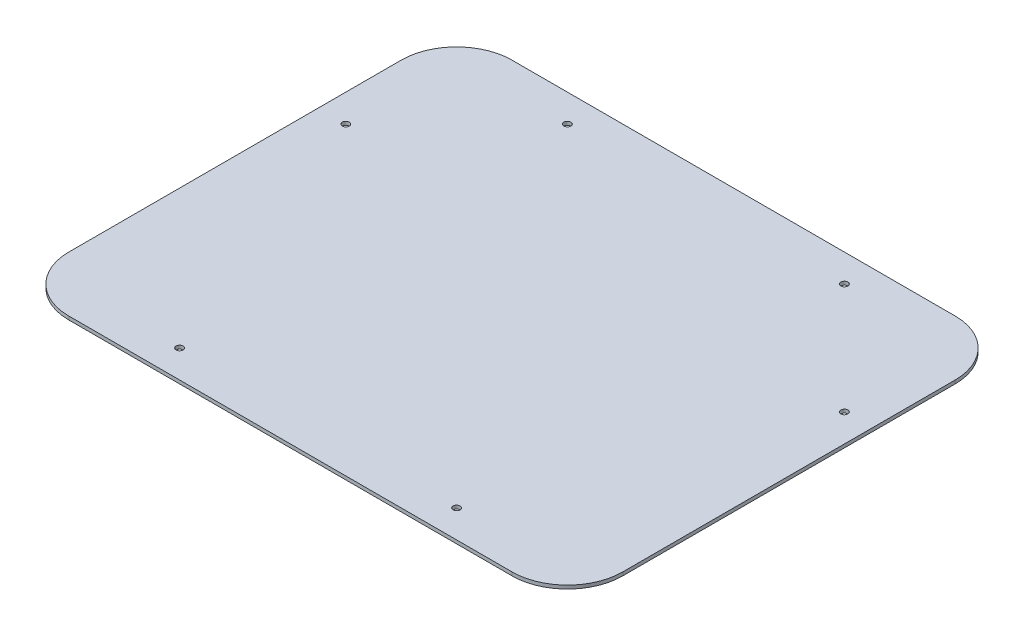
ISO-10303-21;
HEADER;
FILE_DESCRIPTION(('STEP AP214'),'2;1');
FILE_NAME('part.step','',(''),(''),'','','');
FILE_SCHEMA(('AUTOMOTIVE_DESIGN { 1 0 10303 214 1 1 1 1 }'));
ENDSEC;
DATA;
#1=APPLICATION_CONTEXT('core data for automotive mechanical design processes');
#2=APPLICATION_PROTOCOL_DEFINITION('international standard','automotive_design',2000,#1);
#3=PRODUCT_CONTEXT('',#1,'mechanical');
#4=PRODUCT('Part','Part','',(#3));
#5=PRODUCT_RELATED_PRODUCT_CATEGORY('part','',(#4));
#6=PRODUCT_DEFINITION_FORMATION('','',#4);
#7=PRODUCT_DEFINITION_CONTEXT('part definition',#1,'design');
#8=PRODUCT_DEFINITION('design','',#6,#7);
#9=PRODUCT_DEFINITION_SHAPE('','',#8);
#10=(LENGTH_UNIT() NAMED_UNIT(*) SI_UNIT(.MILLI.,.METRE.));
#11=(NAMED_UNIT(*) PLANE_ANGLE_UNIT() SI_UNIT($,.RADIAN.));
#12=(NAMED_UNIT(*) SI_UNIT($,.STERADIAN.) SOLID_ANGLE_UNIT());
#13=UNCERTAINTY_MEASURE_WITH_UNIT(LENGTH_MEASURE(1.E-05),#10,'distance_accuracy_value','');
#14=(GEOMETRIC_REPRESENTATION_CONTEXT(3) GLOBAL_UNCERTAINTY_ASSIGNED_CONTEXT((#13)) GLOBAL_UNIT_ASSIGNED_CONTEXT((#10,
#11,#12)) REPRESENTATION_CONTEXT('',''));
#15=CARTESIAN_POINT('',(0.,0.,0.));
#16=DIRECTION('',(0.,0.,1.));
#17=DIRECTION('',(1.,0.,0.));
#18=AXIS2_PLACEMENT_3D('',#15,#16,#17);
#19=CARTESIAN_POINT('',(-254.,3.175,-203.2));
#20=DIRECTION('',(1.,0.,0.));
#21=DIRECTION('',(0.,0.,-1.));
#22=AXIS2_PLACEMENT_3D('',#19,#20,#21);
#23=PLANE('',#22);
#24=DIRECTION('',(0.,0.,1.));
#25=VECTOR('',#24,1.);
#26=CARTESIAN_POINT('',(-254.,3.175,-203.2));
#27=LINE('',#26,#25);
#28=CARTESIAN_POINT('',(-254.,3.175,-152.4));
#29=VERTEX_POINT('',#28);
#30=CARTESIAN_POINT('',(-254.,3.175,152.4));
#31=VERTEX_POINT('',#30);
#32=EDGE_CURVE('E118',#29,#31,#27,.T.);
#33=ORIENTED_EDGE('',*,*,#32,.F.);
#34=DIRECTION('',(0.,-1.,0.));
#35=VECTOR('',#34,1.);
#36=CARTESIAN_POINT('',(-254.,3.175,-152.4));
#37=LINE('',#36,#35);
#38=CARTESIAN_POINT('',(-254.,0.,-152.4));
#39=VERTEX_POINT('',#38);
#40=EDGE_CURVE('E103',#29,#39,#37,.T.);
#41=ORIENTED_EDGE('',*,*,#40,.T.);
#42=DIRECTION('',(0.,0.,1.));
#43=VECTOR('',#42,1.);
#44=CARTESIAN_POINT('',(-254.,0.,-203.2));
#45=LINE('',#44,#43);
#46=CARTESIAN_POINT('',(-254.,0.,152.4));
#47=VERTEX_POINT('',#46);
#48=EDGE_CURVE('E115',#39,#47,#45,.T.);
#49=ORIENTED_EDGE('',*,*,#48,.T.);
#50=DIRECTION('',(0.,-1.,0.));
#51=VECTOR('',#50,1.);
#52=CARTESIAN_POINT('',(-254.,3.175,152.4));
#53=LINE('',#52,#51);
#54=EDGE_CURVE('E120',#47,#31,#53,.F.);
#55=ORIENTED_EDGE('',*,*,#54,.T.);
#56=EDGE_LOOP('',(#33,#41,#49,#55));
#57=FACE_BOUND('',#56,.T.);
#58=ADVANCED_FACE('F33',(#57),#23,.F.);
#59=CARTESIAN_POINT('',(-254.,3.175,203.2));
#60=DIRECTION('',(0.,0.,-1.));
#61=DIRECTION('',(-1.,0.,0.));
#62=AXIS2_PLACEMENT_3D('',#59,#60,#61);
#63=PLANE('',#62);
#64=DIRECTION('',(1.,0.,0.));
#65=VECTOR('',#64,1.);
#66=CARTESIAN_POINT('',(-254.,0.,203.2));
#67=LINE('',#66,#65);
#68=CARTESIAN_POINT('',(-203.2,0.,203.2));
#69=VERTEX_POINT('',#68);
#70=CARTESIAN_POINT('',(203.2,0.,203.2));
#71=VERTEX_POINT('',#70);
#72=EDGE_CURVE('E124',#69,#71,#67,.T.);
#73=ORIENTED_EDGE('',*,*,#72,.T.);
#74=DIRECTION('',(0.,-1.,0.));
#75=VECTOR('',#74,1.);
#76=CARTESIAN_POINT('',(203.2,3.175,203.2));
#77=LINE('',#76,#75);
#78=CARTESIAN_POINT('',(203.2,3.175,203.2));
#79=VERTEX_POINT('',#78);
#80=EDGE_CURVE('E11',#71,#79,#77,.F.);
#81=ORIENTED_EDGE('',*,*,#80,.T.);
#82=DIRECTION('',(1.,0.,0.));
#83=VECTOR('',#82,1.);
#84=CARTESIAN_POINT('',(-254.,3.175,203.2));
#85=LINE('',#84,#83);
#86=CARTESIAN_POINT('',(-203.2,3.175,203.2));
#87=VERTEX_POINT('',#86);
#88=EDGE_CURVE('E164',#87,#79,#85,.T.);
#89=ORIENTED_EDGE('',*,*,#88,.F.);
#90=DIRECTION('',(0.,-1.,0.));
#91=VECTOR('',#90,1.);
#92=CARTESIAN_POINT('',(-203.2,3.175,203.2));
#93=LINE('',#92,#91);
#94=EDGE_CURVE('E41',#87,#69,#93,.T.);
#95=ORIENTED_EDGE('',*,*,#94,.T.);
#96=EDGE_LOOP('',(#73,#81,#89,#95));
#97=FACE_BOUND('',#96,.T.);
#98=ADVANCED_FACE('F162',(#97),#63,.F.);
#99=CARTESIAN_POINT('',(254.,3.175,-203.2));
#100=DIRECTION('',(-1.,0.,0.));
#101=DIRECTION('',(0.,0.,1.));
#102=AXIS2_PLACEMENT_3D('',#99,#100,#101);
#103=PLANE('',#102);
#104=DIRECTION('',(0.,0.,-1.));
#105=VECTOR('',#104,1.);
#106=CARTESIAN_POINT('',(254.,0.,-203.2));
#107=LINE('',#106,#105);
#108=CARTESIAN_POINT('',(254.,0.,152.4));
#109=VERTEX_POINT('',#108);
#110=CARTESIAN_POINT('',(254.,0.,-152.4));
#111=VERTEX_POINT('',#110);
#112=EDGE_CURVE('E128',#109,#111,#107,.T.);
#113=ORIENTED_EDGE('',*,*,#112,.T.);
#114=DIRECTION('',(0.,-1.,0.));
#115=VECTOR('',#114,1.);
#116=CARTESIAN_POINT('',(254.,3.175,-152.4));
#117=LINE('',#116,#115);
#118=CARTESIAN_POINT('',(254.,3.175,-152.4));
#119=VERTEX_POINT('',#118);
#120=EDGE_CURVE('E48',#111,#119,#117,.F.);
#121=ORIENTED_EDGE('',*,*,#120,.T.);
#122=DIRECTION('',(0.,0.,-1.));
#123=VECTOR('',#122,1.);
#124=CARTESIAN_POINT('',(254.,3.175,-203.2));
#125=LINE('',#124,#123);
#126=CARTESIAN_POINT('',(254.,3.175,152.4));
#127=VERTEX_POINT('',#126);
#128=EDGE_CURVE('E172',#127,#119,#125,.T.);
#129=ORIENTED_EDGE('',*,*,#128,.F.);
#130=DIRECTION('',(0.,-1.,0.));
#131=VECTOR('',#130,1.);
#132=CARTESIAN_POINT('',(254.,3.175,152.4));
#133=LINE('',#132,#131);
#134=EDGE_CURVE('E155',#127,#109,#133,.T.);
#135=ORIENTED_EDGE('',*,*,#134,.T.);
#136=EDGE_LOOP('',(#113,#121,#129,#135));
#137=FACE_BOUND('',#136,.T.);
#138=ADVANCED_FACE('F171',(#137),#103,.F.);
#139=CARTESIAN_POINT('',(-254.,3.175,-203.2));
#140=DIRECTION('',(0.,0.,1.));
#141=DIRECTION('',(1.,0.,0.));
#142=AXIS2_PLACEMENT_3D('',#139,#140,#141);
#143=PLANE('',#142);
#144=DIRECTION('',(-1.,0.,0.));
#145=VECTOR('',#144,1.);
#146=CARTESIAN_POINT('',(-254.,0.,-203.2));
#147=LINE('',#146,#145);
#148=CARTESIAN_POINT('',(203.2,0.,-203.2));
#149=VERTEX_POINT('',#148);
#150=CARTESIAN_POINT('',(-203.2,0.,-203.2));
#151=VERTEX_POINT('',#150);
#152=EDGE_CURVE('E138',#149,#151,#147,.T.);
#153=ORIENTED_EDGE('',*,*,#152,.T.);
#154=DIRECTION('',(0.,-1.,0.));
#155=VECTOR('',#154,1.);
#156=CARTESIAN_POINT('',(-203.2,3.175,-203.2));
#157=LINE('',#156,#155);
#158=CARTESIAN_POINT('',(-203.2,3.175,-203.2));
#159=VERTEX_POINT('',#158);
#160=EDGE_CURVE('E104',#151,#159,#157,.F.);
#161=ORIENTED_EDGE('',*,*,#160,.T.);
#162=DIRECTION('',(-1.,0.,0.));
#163=VECTOR('',#162,1.);
#164=CARTESIAN_POINT('',(-254.,3.175,-203.2));
#165=LINE('',#164,#163);
#166=CARTESIAN_POINT('',(203.2,3.175,-203.2));
#167=VERTEX_POINT('',#166);
#168=EDGE_CURVE('E134',#167,#159,#165,.T.);
#169=ORIENTED_EDGE('',*,*,#168,.F.);
#170=DIRECTION('',(0.,-1.,0.));
#171=VECTOR('',#170,1.);
#172=CARTESIAN_POINT('',(203.2,3.175,-203.2));
#173=LINE('',#172,#171);
#174=EDGE_CURVE('E109',#167,#149,#173,.T.);
#175=ORIENTED_EDGE('',*,*,#174,.T.);
#176=EDGE_LOOP('',(#153,#161,#169,#175));
#177=FACE_BOUND('',#176,.T.);
#178=ADVANCED_FACE('F217',(#177),#143,.F.);
#179=CARTESIAN_POINT('',(-254.,3.175,203.2));
#180=DIRECTION('',(0.,1.,0.));
#181=DIRECTION('',(0.,0.,1.));
#182=AXIS2_PLACEMENT_3D('',#179,#180,#181);
#183=PLANE('',#182);
#184=CARTESIAN_POINT('',(-228.6,3.175,-76.2));
#185=DIRECTION('',(0.,1.,0.));
#186=DIRECTION('',(0.,0.,1.));
#187=AXIS2_PLACEMENT_3D('',#184,#185,#186);
#188=CIRCLE('',#187,3.17499999999998);
#189=CARTESIAN_POINT('',(-228.6,3.175,-73.025));
#190=VERTEX_POINT('',#189);
#191=EDGE_CURVE('E207',#190,#190,#188,.T.);
#192=ORIENTED_EDGE('',*,*,#191,.F.);
#193=EDGE_LOOP('',(#192));
#194=FACE_BOUND('',#193,.T.);
#195=CARTESIAN_POINT('',(-127.,3.175,-177.8));
#196=DIRECTION('',(0.,1.,0.));
#197=DIRECTION('',(0.,0.,1.));
#198=AXIS2_PLACEMENT_3D('',#195,#196,#197);
#199=CIRCLE('',#198,3.17499999999998);
#200=CARTESIAN_POINT('',(-127.,3.175,-174.625));
#201=VERTEX_POINT('',#200);
#202=EDGE_CURVE('E201',#201,#201,#199,.T.);
#203=ORIENTED_EDGE('',*,*,#202,.F.);
#204=EDGE_LOOP('',(#203));
#205=FACE_BOUND('',#204,.T.);
#206=CARTESIAN_POINT('',(127.,3.175,-177.8));
#207=DIRECTION('',(0.,1.,0.));
#208=DIRECTION('',(0.,0.,1.));
#209=AXIS2_PLACEMENT_3D('',#206,#207,#208);
#210=CIRCLE('',#209,3.17499999999998);
#211=CARTESIAN_POINT('',(127.,3.175,-174.625));
#212=VERTEX_POINT('',#211);
#213=EDGE_CURVE('E195',#212,#212,#210,.T.);
#214=ORIENTED_EDGE('',*,*,#213,.F.);
#215=EDGE_LOOP('',(#214));
#216=FACE_BOUND('',#215,.T.);
#217=CARTESIAN_POINT('',(228.6,3.175,-76.2));
#218=DIRECTION('',(0.,1.,0.));
#219=DIRECTION('',(0.,0.,1.));
#220=AXIS2_PLACEMENT_3D('',#217,#218,#219);
#221=CIRCLE('',#220,3.17499999999998);
#222=CARTESIAN_POINT('',(228.6,3.175,-73.025));
#223=VERTEX_POINT('',#222);
#224=EDGE_CURVE('E189',#223,#223,#221,.T.);
#225=ORIENTED_EDGE('',*,*,#224,.F.);
#226=EDGE_LOOP('',(#225));
#227=FACE_BOUND('',#226,.T.);
#228=CARTESIAN_POINT('',(127.,3.175,177.8));
#229=DIRECTION('',(0.,1.,0.));
#230=DIRECTION('',(0.,0.,1.));
#231=AXIS2_PLACEMENT_3D('',#228,#229,#230);
#232=CIRCLE('',#231,3.17499999999998);
#233=CARTESIAN_POINT('',(127.,3.175,180.975));
#234=VERTEX_POINT('',#233);
#235=EDGE_CURVE('E183',#234,#234,#232,.T.);
#236=ORIENTED_EDGE('',*,*,#235,.F.);
#237=EDGE_LOOP('',(#236));
#238=FACE_BOUND('',#237,.T.);
#239=CARTESIAN_POINT('',(-127.,3.175,177.8));
#240=DIRECTION('',(0.,1.,0.));
#241=DIRECTION('',(0.,0.,1.));
#242=AXIS2_PLACEMENT_3D('',#239,#240,#241);
#243=CIRCLE('',#242,3.17499999999998);
#244=CARTESIAN_POINT('',(-127.,3.175,180.975));
#245=VERTEX_POINT('',#244);
#246=EDGE_CURVE('E131',#245,#245,#243,.T.);
#247=ORIENTED_EDGE('',*,*,#246,.F.);
#248=EDGE_LOOP('',(#247));
#249=FACE_BOUND('',#248,.T.);
#250=ORIENTED_EDGE('',*,*,#168,.T.);
#251=CARTESIAN_POINT('',(-203.2,3.175,-152.4));
#252=DIRECTION('',(0.,1.,0.));
#253=DIRECTION('',(0.,0.,1.));
#254=AXIS2_PLACEMENT_3D('',#251,#252,#253);
#255=CIRCLE('',#254,50.8);
#256=EDGE_CURVE('E153',#159,#29,#255,.T.);
#257=ORIENTED_EDGE('',*,*,#256,.T.);
#258=ORIENTED_EDGE('',*,*,#32,.T.);
#259=CARTESIAN_POINT('',(-203.2,3.175,152.4));
#260=DIRECTION('',(0.,1.,0.));
#261=DIRECTION('',(0.,0.,1.));
#262=AXIS2_PLACEMENT_3D('',#259,#260,#261);
#263=CIRCLE('',#262,50.8);
#264=EDGE_CURVE('E148',#31,#87,#263,.T.);
#265=ORIENTED_EDGE('',*,*,#264,.T.);
#266=ORIENTED_EDGE('',*,*,#88,.T.);
#267=CARTESIAN_POINT('',(203.2,3.175,152.4));
#268=DIRECTION('',(0.,1.,0.));
#269=DIRECTION('',(0.,0.,1.));
#270=AXIS2_PLACEMENT_3D('',#267,#268,#269);
#271=CIRCLE('',#270,50.8);
#272=EDGE_CURVE('E55',#79,#127,#271,.T.);
#273=ORIENTED_EDGE('',*,*,#272,.T.);
#274=ORIENTED_EDGE('',*,*,#128,.T.);
#275=CARTESIAN_POINT('',(203.2,3.175,-152.4));
#276=DIRECTION('',(0.,1.,0.));
#277=DIRECTION('',(0.,0.,1.));
#278=AXIS2_PLACEMENT_3D('',#275,#276,#277);
#279=CIRCLE('',#278,50.8);
#280=EDGE_CURVE('E151',#119,#167,#279,.T.);
#281=ORIENTED_EDGE('',*,*,#280,.T.);
#282=EDGE_LOOP('',(#250,#257,#258,#265,#266,#273,#274,#281));
#283=FACE_BOUND('',#282,.T.);
#284=ADVANCED_FACE('F214',(#194,#205,#216,#227,#238,#249,#283),#183,.T.);
#285=CARTESIAN_POINT('',(-254.,0.,203.2));
#286=DIRECTION('',(0.,1.,0.));
#287=DIRECTION('',(0.,0.,1.));
#288=AXIS2_PLACEMENT_3D('',#285,#286,#287);
#289=PLANE('',#288);
#290=CARTESIAN_POINT('',(-228.6,0.,-76.2));
#291=DIRECTION('',(0.,1.,0.));
#292=DIRECTION('',(0.,0.,1.));
#293=AXIS2_PLACEMENT_3D('',#290,#291,#292);
#294=CIRCLE('',#293,3.17499999999998);
#295=CARTESIAN_POINT('',(-228.6,0.,-73.025));
#296=VERTEX_POINT('',#295);
#297=EDGE_CURVE('E204',#296,#296,#294,.T.);
#298=ORIENTED_EDGE('',*,*,#297,.T.);
#299=EDGE_LOOP('',(#298));
#300=FACE_BOUND('',#299,.T.);
#301=CARTESIAN_POINT('',(-127.,0.,-177.8));
#302=DIRECTION('',(0.,1.,0.));
#303=DIRECTION('',(0.,0.,1.));
#304=AXIS2_PLACEMENT_3D('',#301,#302,#303);
#305=CIRCLE('',#304,3.17499999999998);
#306=CARTESIAN_POINT('',(-127.,0.,-174.625));
#307=VERTEX_POINT('',#306);
#308=EDGE_CURVE('E198',#307,#307,#305,.T.);
#309=ORIENTED_EDGE('',*,*,#308,.T.);
#310=EDGE_LOOP('',(#309));
#311=FACE_BOUND('',#310,.T.);
#312=CARTESIAN_POINT('',(127.,0.,-177.8));
#313=DIRECTION('',(0.,1.,0.));
#314=DIRECTION('',(0.,0.,1.));
#315=AXIS2_PLACEMENT_3D('',#312,#313,#314);
#316=CIRCLE('',#315,3.17499999999998);
#317=CARTESIAN_POINT('',(127.,0.,-174.625));
#318=VERTEX_POINT('',#317);
#319=EDGE_CURVE('E192',#318,#318,#316,.T.);
#320=ORIENTED_EDGE('',*,*,#319,.T.);
#321=EDGE_LOOP('',(#320));
#322=FACE_BOUND('',#321,.T.);
#323=CARTESIAN_POINT('',(228.6,0.,-76.2));
#324=DIRECTION('',(0.,1.,0.));
#325=DIRECTION('',(0.,0.,1.));
#326=AXIS2_PLACEMENT_3D('',#323,#324,#325);
#327=CIRCLE('',#326,3.17499999999998);
#328=CARTESIAN_POINT('',(228.6,0.,-73.025));
#329=VERTEX_POINT('',#328);
#330=EDGE_CURVE('E186',#329,#329,#327,.T.);
#331=ORIENTED_EDGE('',*,*,#330,.T.);
#332=EDGE_LOOP('',(#331));
#333=FACE_BOUND('',#332,.T.);
#334=CARTESIAN_POINT('',(127.,0.,177.8));
#335=DIRECTION('',(0.,1.,0.));
#336=DIRECTION('',(0.,0.,1.));
#337=AXIS2_PLACEMENT_3D('',#334,#335,#336);
#338=CIRCLE('',#337,3.17499999999998);
#339=CARTESIAN_POINT('',(127.,0.,180.975));
#340=VERTEX_POINT('',#339);
#341=EDGE_CURVE('E180',#340,#340,#338,.T.);
#342=ORIENTED_EDGE('',*,*,#341,.T.);
#343=EDGE_LOOP('',(#342));
#344=FACE_BOUND('',#343,.T.);
#345=CARTESIAN_POINT('',(-127.,0.,177.8));
#346=DIRECTION('',(0.,1.,0.));
#347=DIRECTION('',(0.,0.,1.));
#348=AXIS2_PLACEMENT_3D('',#345,#346,#347);
#349=CIRCLE('',#348,3.17499999999998);
#350=CARTESIAN_POINT('',(-127.,0.,180.975));
#351=VERTEX_POINT('',#350);
#352=EDGE_CURVE('E125',#351,#351,#349,.T.);
#353=ORIENTED_EDGE('',*,*,#352,.T.);
#354=EDGE_LOOP('',(#353));
#355=FACE_BOUND('',#354,.T.);
#356=ORIENTED_EDGE('',*,*,#48,.F.);
#357=CARTESIAN_POINT('',(-203.2,0.,-152.4));
#358=DIRECTION('',(0.,1.,0.));
#359=DIRECTION('',(0.,0.,1.));
#360=AXIS2_PLACEMENT_3D('',#357,#358,#359);
#361=CIRCLE('',#360,50.8);
#362=EDGE_CURVE('E99',#39,#151,#361,.F.);
#363=ORIENTED_EDGE('',*,*,#362,.T.);
#364=ORIENTED_EDGE('',*,*,#152,.F.);
#365=CARTESIAN_POINT('',(203.2,0.,-152.4));
#366=DIRECTION('',(0.,1.,0.));
#367=DIRECTION('',(0.,0.,1.));
#368=AXIS2_PLACEMENT_3D('',#365,#366,#367);
#369=CIRCLE('',#368,50.8);
#370=EDGE_CURVE('E110',#149,#111,#369,.F.);
#371=ORIENTED_EDGE('',*,*,#370,.T.);
#372=ORIENTED_EDGE('',*,*,#112,.F.);
#373=CARTESIAN_POINT('',(203.2,0.,152.4));
#374=DIRECTION('',(0.,1.,0.));
#375=DIRECTION('',(0.,0.,1.));
#376=AXIS2_PLACEMENT_3D('',#373,#374,#375);
#377=CIRCLE('',#376,50.8);
#378=EDGE_CURVE('E142',#109,#71,#377,.F.);
#379=ORIENTED_EDGE('',*,*,#378,.T.);
#380=ORIENTED_EDGE('',*,*,#72,.F.);
#381=CARTESIAN_POINT('',(-203.2,0.,152.4));
#382=DIRECTION('',(0.,1.,0.));
#383=DIRECTION('',(0.,0.,1.));
#384=AXIS2_PLACEMENT_3D('',#381,#382,#383);
#385=CIRCLE('',#384,50.8);
#386=EDGE_CURVE('E119',#69,#47,#385,.F.);
#387=ORIENTED_EDGE('',*,*,#386,.T.);
#388=EDGE_LOOP('',(#356,#363,#364,#371,#372,#379,#380,#387));
#389=FACE_BOUND('',#388,.T.);
#390=ADVANCED_FACE('F122',(#300,#311,#322,#333,#344,#355,#389),#289,.F.);
#391=CARTESIAN_POINT('',(-203.2,3.175,-152.4));
#392=DIRECTION('',(0.,-1.,0.));
#393=DIRECTION('',(0.,0.,-1.));
#394=AXIS2_PLACEMENT_3D('',#391,#392,#393);
#395=CYLINDRICAL_SURFACE('',#394,50.8);
#396=ORIENTED_EDGE('',*,*,#256,.F.);
#397=ORIENTED_EDGE('',*,*,#160,.F.);
#398=ORIENTED_EDGE('',*,*,#362,.F.);
#399=ORIENTED_EDGE('',*,*,#40,.F.);
#400=EDGE_LOOP('',(#396,#397,#398,#399));
#401=FACE_BOUND('',#400,.T.);
#402=ADVANCED_FACE('F102',(#401),#395,.T.);
#403=CARTESIAN_POINT('',(203.2,3.175,-152.4));
#404=DIRECTION('',(0.,-1.,0.));
#405=DIRECTION('',(0.,0.,-1.));
#406=AXIS2_PLACEMENT_3D('',#403,#404,#405);
#407=CYLINDRICAL_SURFACE('',#406,50.8);
#408=ORIENTED_EDGE('',*,*,#280,.F.);
#409=ORIENTED_EDGE('',*,*,#120,.F.);
#410=ORIENTED_EDGE('',*,*,#370,.F.);
#411=ORIENTED_EDGE('',*,*,#174,.F.);
#412=EDGE_LOOP('',(#408,#409,#410,#411));
#413=FACE_BOUND('',#412,.T.);
#414=ADVANCED_FACE('F232',(#413),#407,.T.);
#415=CARTESIAN_POINT('',(203.2,3.175,152.4));
#416=DIRECTION('',(0.,-1.,0.));
#417=DIRECTION('',(0.,0.,-1.));
#418=AXIS2_PLACEMENT_3D('',#415,#416,#417);
#419=CYLINDRICAL_SURFACE('',#418,50.8);
#420=ORIENTED_EDGE('',*,*,#272,.F.);
#421=ORIENTED_EDGE('',*,*,#80,.F.);
#422=ORIENTED_EDGE('',*,*,#378,.F.);
#423=ORIENTED_EDGE('',*,*,#134,.F.);
#424=EDGE_LOOP('',(#420,#421,#422,#423));
#425=FACE_BOUND('',#424,.T.);
#426=ADVANCED_FACE('F170',(#425),#419,.T.);
#427=CARTESIAN_POINT('',(-203.2,3.175,152.4));
#428=DIRECTION('',(0.,-1.,0.));
#429=DIRECTION('',(0.,0.,-1.));
#430=AXIS2_PLACEMENT_3D('',#427,#428,#429);
#431=CYLINDRICAL_SURFACE('',#430,50.8);
#432=ORIENTED_EDGE('',*,*,#264,.F.);
#433=ORIENTED_EDGE('',*,*,#54,.F.);
#434=ORIENTED_EDGE('',*,*,#386,.F.);
#435=ORIENTED_EDGE('',*,*,#94,.F.);
#436=EDGE_LOOP('',(#432,#433,#434,#435));
#437=FACE_BOUND('',#436,.T.);
#438=ADVANCED_FACE('F35',(#437),#431,.T.);
#439=CARTESIAN_POINT('',(-127.,3.175,177.8));
#440=DIRECTION('',(0.,1.,0.));
#441=DIRECTION('',(0.,0.,1.));
#442=AXIS2_PLACEMENT_3D('',#439,#440,#441);
#443=CYLINDRICAL_SURFACE('',#442,3.17499999999998);
#444=ORIENTED_EDGE('',*,*,#246,.T.);
#445=EDGE_LOOP('',(#444));
#446=FACE_BOUND('',#445,.T.);
#447=ORIENTED_EDGE('',*,*,#352,.F.);
#448=EDGE_LOOP('',(#447));
#449=FACE_BOUND('',#448,.T.);
#450=ADVANCED_FACE('F254',(#446,#449),#443,.F.);
#451=CARTESIAN_POINT('',(127.,3.175,177.8));
#452=DIRECTION('',(0.,1.,0.));
#453=DIRECTION('',(0.,0.,1.));
#454=AXIS2_PLACEMENT_3D('',#451,#452,#453);
#455=CYLINDRICAL_SURFACE('',#454,3.17499999999998);
#456=ORIENTED_EDGE('',*,*,#235,.T.);
#457=EDGE_LOOP('',(#456));
#458=FACE_BOUND('',#457,.T.);
#459=ORIENTED_EDGE('',*,*,#341,.F.);
#460=EDGE_LOOP('',(#459));
#461=FACE_BOUND('',#460,.T.);
#462=ADVANCED_FACE('F257',(#458,#461),#455,.F.);
#463=CARTESIAN_POINT('',(228.6,3.175,-76.2));
#464=DIRECTION('',(0.,1.,0.));
#465=DIRECTION('',(0.,0.,1.));
#466=AXIS2_PLACEMENT_3D('',#463,#464,#465);
#467=CYLINDRICAL_SURFACE('',#466,3.17499999999998);
#468=ORIENTED_EDGE('',*,*,#224,.T.);
#469=EDGE_LOOP('',(#468));
#470=FACE_BOUND('',#469,.T.);
#471=ORIENTED_EDGE('',*,*,#330,.F.);
#472=EDGE_LOOP('',(#471));
#473=FACE_BOUND('',#472,.T.);
#474=ADVANCED_FACE('F261',(#470,#473),#467,.F.);
#475=CARTESIAN_POINT('',(127.,3.175,-177.8));
#476=DIRECTION('',(0.,1.,0.));
#477=DIRECTION('',(0.,0.,1.));
#478=AXIS2_PLACEMENT_3D('',#475,#476,#477);
#479=CYLINDRICAL_SURFACE('',#478,3.17499999999998);
#480=ORIENTED_EDGE('',*,*,#213,.T.);
#481=EDGE_LOOP('',(#480));
#482=FACE_BOUND('',#481,.T.);
#483=ORIENTED_EDGE('',*,*,#319,.F.);
#484=EDGE_LOOP('',(#483));
#485=FACE_BOUND('',#484,.T.);
#486=ADVANCED_FACE('F265',(#482,#485),#479,.F.);
#487=CARTESIAN_POINT('',(-127.,3.175,-177.8));
#488=DIRECTION('',(0.,1.,0.));
#489=DIRECTION('',(0.,0.,1.));
#490=AXIS2_PLACEMENT_3D('',#487,#488,#489);
#491=CYLINDRICAL_SURFACE('',#490,3.17499999999998);
#492=ORIENTED_EDGE('',*,*,#202,.T.);
#493=EDGE_LOOP('',(#492));
#494=FACE_BOUND('',#493,.T.);
#495=ORIENTED_EDGE('',*,*,#308,.F.);
#496=EDGE_LOOP('',(#495));
#497=FACE_BOUND('',#496,.T.);
#498=ADVANCED_FACE('F269',(#494,#497),#491,.F.);
#499=CARTESIAN_POINT('',(-228.6,3.175,-76.2));
#500=DIRECTION('',(0.,1.,0.));
#501=DIRECTION('',(0.,0.,1.));
#502=AXIS2_PLACEMENT_3D('',#499,#500,#501);
#503=CYLINDRICAL_SURFACE('',#502,3.17499999999998);
#504=ORIENTED_EDGE('',*,*,#191,.T.);
#505=EDGE_LOOP('',(#504));
#506=FACE_BOUND('',#505,.T.);
#507=ORIENTED_EDGE('',*,*,#297,.F.);
#508=EDGE_LOOP('',(#507));
#509=FACE_BOUND('',#508,.T.);
#510=ADVANCED_FACE('F211',(#506,#509),#503,.F.);
#511=CLOSED_SHELL('',(#58,#98,#138,#178,#284,#390,#402,#414,#426,#438,#450,#462,#474,#486,#498,#510));
#512=MANIFOLD_SOLID_BREP('B2',#511);
#513=ADVANCED_BREP_SHAPE_REPRESENTATION('',(#18,#512),#14);
#514=SHAPE_DEFINITION_REPRESENTATION(#9,#513);
ENDSEC;
END-ISO-10303-21;
